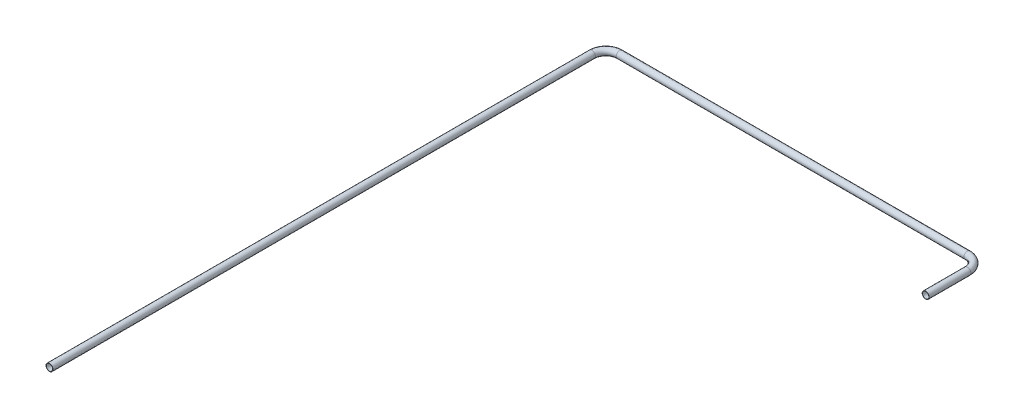
ISO-10303-21;
HEADER;
FILE_DESCRIPTION(('STEP AP214'),'2;1');
FILE_NAME('part.step','',(''),(''),'','','');
FILE_SCHEMA(('AUTOMOTIVE_DESIGN { 1 0 10303 214 1 1 1 1 }'));
ENDSEC;
DATA;
#1=APPLICATION_CONTEXT('core data for automotive mechanical design processes');
#2=APPLICATION_PROTOCOL_DEFINITION('international standard','automotive_design',2000,#1);
#3=PRODUCT_CONTEXT('',#1,'mechanical');
#4=PRODUCT('Part','Part','',(#3));
#5=PRODUCT_RELATED_PRODUCT_CATEGORY('part','',(#4));
#6=PRODUCT_DEFINITION_FORMATION('','',#4);
#7=PRODUCT_DEFINITION_CONTEXT('part definition',#1,'design');
#8=PRODUCT_DEFINITION('design','',#6,#7);
#9=PRODUCT_DEFINITION_SHAPE('','',#8);
#10=(LENGTH_UNIT() NAMED_UNIT(*) SI_UNIT(.MILLI.,.METRE.));
#11=(NAMED_UNIT(*) PLANE_ANGLE_UNIT() SI_UNIT($,.RADIAN.));
#12=(NAMED_UNIT(*) SI_UNIT($,.STERADIAN.) SOLID_ANGLE_UNIT());
#13=UNCERTAINTY_MEASURE_WITH_UNIT(LENGTH_MEASURE(1.E-05),#10,'distance_accuracy_value','');
#14=(GEOMETRIC_REPRESENTATION_CONTEXT(3) GLOBAL_UNCERTAINTY_ASSIGNED_CONTEXT((#13)) GLOBAL_UNIT_ASSIGNED_CONTEXT((#10,
#11,#12)) REPRESENTATION_CONTEXT('',''));
#15=CARTESIAN_POINT('',(0.,0.,0.));
#16=DIRECTION('',(0.,0.,1.));
#17=DIRECTION('',(1.,0.,0.));
#18=AXIS2_PLACEMENT_3D('',#15,#16,#17);
#19=CARTESIAN_POINT('',(-4114.8,0.,6096.));
#20=DIRECTION('',(0.,0.,-1.));
#21=DIRECTION('',(-1.,0.,0.));
#22=AXIS2_PLACEMENT_3D('',#19,#20,#21);
#23=CYLINDRICAL_SURFACE('',#22,38.1);
#24=CARTESIAN_POINT('',(-4114.8,0.,152.4));
#25=DIRECTION('',(0.,0.,-1.));
#26=DIRECTION('',(-1.,0.,0.));
#27=AXIS2_PLACEMENT_3D('',#24,#25,#26);
#28=CIRCLE('',#27,38.1);
#29=CARTESIAN_POINT('',(-4152.9,0.,152.4));
#30=VERTEX_POINT('',#29);
#31=EDGE_CURVE('E82',#30,#30,#28,.T.);
#32=ORIENTED_EDGE('',*,*,#31,.F.);
#33=EDGE_LOOP('',(#32));
#34=FACE_BOUND('',#33,.T.);
#35=CARTESIAN_POINT('',(-4114.8,0.,6096.));
#36=DIRECTION('',(0.,0.,-1.));
#37=DIRECTION('',(-1.,0.,0.));
#38=AXIS2_PLACEMENT_3D('',#35,#36,#37);
#39=CIRCLE('',#38,38.1);
#40=CARTESIAN_POINT('',(-4152.9,0.,6096.));
#41=VERTEX_POINT('',#40);
#42=EDGE_CURVE('E49',#41,#41,#39,.T.);
#43=ORIENTED_EDGE('',*,*,#42,.T.);
#44=EDGE_LOOP('',(#43));
#45=FACE_BOUND('',#44,.T.);
#46=ADVANCED_FACE('F34',(#34,#45),#23,.T.);
#47=CARTESIAN_POINT('',(-3962.4,0.,152.4));
#48=DIRECTION('',(0.,-1.,0.));
#49=DIRECTION('',(0.,0.,-1.));
#50=AXIS2_PLACEMENT_3D('',#47,#48,#49);
#51=TOROIDAL_SURFACE('',#50,152.4,38.1);
#52=CARTESIAN_POINT('',(-3962.4,0.,6.75705473597476E-13));
#53=DIRECTION('',(1.,0.,0.));
#54=DIRECTION('',(0.,0.,-1.));
#55=AXIS2_PLACEMENT_3D('',#52,#53,#54);
#56=CIRCLE('',#55,38.1);
#57=CARTESIAN_POINT('',(-3962.4,0.,-38.0999999999992));
#58=VERTEX_POINT('',#57);
#59=EDGE_CURVE('E85',#58,#58,#56,.T.);
#60=CARTESIAN_POINT('',(-3962.4,0.,152.4));
#61=DIRECTION('',(0.,-1.,0.));
#62=DIRECTION('',(0.,0.,-1.));
#63=AXIS2_PLACEMENT_3D('',#60,#61,#62);
#64=CIRCLE('',#63,190.5);
#65=EDGE_CURVE('',#30,#58,#64,.T.);
#66=ORIENTED_EDGE('',*,*,#31,.T.);
#67=ORIENTED_EDGE('',*,*,#59,.F.);
#68=ORIENTED_EDGE('',*,*,#65,.T.);
#69=ORIENTED_EDGE('',*,*,#65,.F.);
#70=EDGE_LOOP('',(#66,#68,#67,#69));
#71=FACE_BOUND('',#70,.T.);
#72=ADVANCED_FACE('F103',(#71),#51,.T.);
#73=CARTESIAN_POINT('',(-3962.4,0.,4.81416444288074E-13));
#74=DIRECTION('',(1.,0.,0.));
#75=DIRECTION('',(0.,0.,-1.));
#76=AXIS2_PLACEMENT_3D('',#73,#74,#75);
#77=CYLINDRICAL_SURFACE('',#76,38.1);
#78=CARTESIAN_POINT('',(-152.4,0.,0.));
#79=DIRECTION('',(1.,0.,0.));
#80=DIRECTION('',(0.,0.,-1.));
#81=AXIS2_PLACEMENT_3D('',#78,#79,#80);
#82=CIRCLE('',#81,38.1);
#83=CARTESIAN_POINT('',(-152.4,0.,-38.1));
#84=VERTEX_POINT('',#83);
#85=EDGE_CURVE('E87',#84,#84,#82,.T.);
#86=ORIENTED_EDGE('',*,*,#85,.F.);
#87=EDGE_LOOP('',(#86));
#88=FACE_BOUND('',#87,.T.);
#89=ORIENTED_EDGE('',*,*,#59,.T.);
#90=EDGE_LOOP('',(#89));
#91=FACE_BOUND('',#90,.T.);
#92=ADVANCED_FACE('F97',(#88,#91),#77,.T.);
#93=CARTESIAN_POINT('',(-152.4,0.,152.4));
#94=DIRECTION('',(0.,-1.,0.));
#95=DIRECTION('',(0.,0.,-1.));
#96=AXIS2_PLACEMENT_3D('',#93,#94,#95);
#97=TOROIDAL_SURFACE('',#96,152.4,38.1);
#98=CARTESIAN_POINT('',(0.,0.,152.4));
#99=DIRECTION('',(0.,0.,1.));
#100=DIRECTION('',(1.,0.,0.));
#101=AXIS2_PLACEMENT_3D('',#98,#99,#100);
#102=CIRCLE('',#101,38.1);
#103=CARTESIAN_POINT('',(38.0999999999999,0.,152.4));
#104=VERTEX_POINT('',#103);
#105=EDGE_CURVE('E38',#104,#104,#102,.T.);
#106=CARTESIAN_POINT('',(-152.4,0.,152.4));
#107=DIRECTION('',(0.,-1.,0.));
#108=DIRECTION('',(0.,0.,-1.));
#109=AXIS2_PLACEMENT_3D('',#106,#107,#108);
#110=CIRCLE('',#109,190.5);
#111=EDGE_CURVE('',#84,#104,#110,.T.);
#112=ORIENTED_EDGE('',*,*,#85,.T.);
#113=ORIENTED_EDGE('',*,*,#105,.F.);
#114=ORIENTED_EDGE('',*,*,#111,.T.);
#115=ORIENTED_EDGE('',*,*,#111,.F.);
#116=EDGE_LOOP('',(#112,#114,#113,#115));
#117=FACE_BOUND('',#116,.T.);
#118=ADVANCED_FACE('F95',(#117),#97,.T.);
#119=CARTESIAN_POINT('',(0.,0.,152.4));
#120=DIRECTION('',(0.,0.,1.));
#121=DIRECTION('',(1.,0.,0.));
#122=AXIS2_PLACEMENT_3D('',#119,#120,#121);
#123=CYLINDRICAL_SURFACE('',#122,38.1);
#124=CARTESIAN_POINT('',(0.,0.,609.6));
#125=DIRECTION('',(0.,0.,1.));
#126=DIRECTION('',(1.,0.,0.));
#127=AXIS2_PLACEMENT_3D('',#124,#125,#126);
#128=CIRCLE('',#127,38.1);
#129=CARTESIAN_POINT('',(38.1,0.,609.6));
#130=VERTEX_POINT('',#129);
#131=EDGE_CURVE('E54',#130,#130,#128,.T.);
#132=ORIENTED_EDGE('',*,*,#131,.F.);
#133=EDGE_LOOP('',(#132));
#134=FACE_BOUND('',#133,.T.);
#135=ORIENTED_EDGE('',*,*,#105,.T.);
#136=EDGE_LOOP('',(#135));
#137=FACE_BOUND('',#136,.T.);
#138=ADVANCED_FACE('F36',(#134,#137),#123,.T.);
#139=CARTESIAN_POINT('',(-4114.8,0.,6096.));
#140=DIRECTION('',(0.,0.,-1.));
#141=DIRECTION('',(-1.,0.,0.));
#142=AXIS2_PLACEMENT_3D('',#139,#140,#141);
#143=PLANE('',#142);
#144=CARTESIAN_POINT('',(-4114.8,0.,6096.));
#145=DIRECTION('',(0.,0.,-1.));
#146=DIRECTION('',(-1.,0.,0.));
#147=AXIS2_PLACEMENT_3D('',#144,#145,#146);
#148=CIRCLE('',#147,34.925);
#149=CARTESIAN_POINT('',(-4149.725,0.,6096.));
#150=VERTEX_POINT('',#149);
#151=EDGE_CURVE('E80',#150,#150,#148,.F.);
#152=ORIENTED_EDGE('',*,*,#151,.F.);
#153=EDGE_LOOP('',(#152));
#154=FACE_BOUND('',#153,.T.);
#155=ORIENTED_EDGE('',*,*,#42,.F.);
#156=EDGE_LOOP('',(#155));
#157=FACE_BOUND('',#156,.T.);
#158=ADVANCED_FACE('F102',(#154,#157),#143,.F.);
#159=CARTESIAN_POINT('',(0.,0.,609.6));
#160=DIRECTION('',(0.,0.,1.));
#161=DIRECTION('',(1.,0.,0.));
#162=AXIS2_PLACEMENT_3D('',#159,#160,#161);
#163=PLANE('',#162);
#164=CARTESIAN_POINT('',(0.,0.,609.6));
#165=DIRECTION('',(0.,0.,1.));
#166=DIRECTION('',(1.,0.,0.));
#167=AXIS2_PLACEMENT_3D('',#164,#165,#166);
#168=CIRCLE('',#167,34.925);
#169=CARTESIAN_POINT('',(34.925,0.,609.6));
#170=VERTEX_POINT('',#169);
#171=EDGE_CURVE('E11',#170,#170,#168,.F.);
#172=ORIENTED_EDGE('',*,*,#171,.T.);
#173=EDGE_LOOP('',(#172));
#174=FACE_BOUND('',#173,.T.);
#175=ORIENTED_EDGE('',*,*,#131,.T.);
#176=EDGE_LOOP('',(#175));
#177=FACE_BOUND('',#176,.T.);
#178=ADVANCED_FACE('F61',(#174,#177),#163,.T.);
#179=CARTESIAN_POINT('',(-4114.8,0.,6096.));
#180=DIRECTION('',(0.,0.,-1.));
#181=DIRECTION('',(-1.,0.,0.));
#182=AXIS2_PLACEMENT_3D('',#179,#180,#181);
#183=CYLINDRICAL_SURFACE('',#182,34.925);
#184=CARTESIAN_POINT('',(-4114.8,0.,152.4));
#185=DIRECTION('',(0.,0.,-1.));
#186=DIRECTION('',(-1.,0.,0.));
#187=AXIS2_PLACEMENT_3D('',#184,#185,#186);
#188=CIRCLE('',#187,34.925);
#189=CARTESIAN_POINT('',(-4149.725,0.,152.4));
#190=VERTEX_POINT('',#189);
#191=EDGE_CURVE('E136',#190,#190,#188,.F.);
#192=ORIENTED_EDGE('',*,*,#191,.F.);
#193=EDGE_LOOP('',(#192));
#194=FACE_BOUND('',#193,.T.);
#195=ORIENTED_EDGE('',*,*,#151,.T.);
#196=EDGE_LOOP('',(#195));
#197=FACE_BOUND('',#196,.T.);
#198=ADVANCED_FACE('F117',(#194,#197),#183,.F.);
#199=CARTESIAN_POINT('',(-3962.4,0.,152.4));
#200=DIRECTION('',(0.,-1.,0.));
#201=DIRECTION('',(0.,0.,-1.));
#202=AXIS2_PLACEMENT_3D('',#199,#200,#201);
#203=TOROIDAL_SURFACE('',#202,152.4,34.925);
#204=CARTESIAN_POINT('',(-3962.4,0.,6.75705473597476E-13));
#205=DIRECTION('',(1.,0.,0.));
#206=DIRECTION('',(0.,0.,-1.));
#207=AXIS2_PLACEMENT_3D('',#204,#205,#206);
#208=CIRCLE('',#207,34.925);
#209=CARTESIAN_POINT('',(-3962.4,0.,-34.9249999999992));
#210=VERTEX_POINT('',#209);
#211=EDGE_CURVE('E75',#210,#210,#208,.F.);
#212=CARTESIAN_POINT('',(-3962.4,0.,152.4));
#213=DIRECTION('',(0.,-1.,0.));
#214=DIRECTION('',(0.,0.,-1.));
#215=AXIS2_PLACEMENT_3D('',#212,#213,#214);
#216=CIRCLE('',#215,187.325);
#217=EDGE_CURVE('',#190,#210,#216,.T.);
#218=ORIENTED_EDGE('',*,*,#191,.T.);
#219=ORIENTED_EDGE('',*,*,#211,.F.);
#220=ORIENTED_EDGE('',*,*,#217,.T.);
#221=ORIENTED_EDGE('',*,*,#217,.F.);
#222=EDGE_LOOP('',(#218,#220,#219,#221));
#223=FACE_BOUND('',#222,.T.);
#224=ADVANCED_FACE('F124',(#223),#203,.F.);
#225=CARTESIAN_POINT('',(-3962.4,0.,4.81416444288074E-13));
#226=DIRECTION('',(1.,0.,0.));
#227=DIRECTION('',(0.,0.,-1.));
#228=AXIS2_PLACEMENT_3D('',#225,#226,#227);
#229=CYLINDRICAL_SURFACE('',#228,34.925);
#230=CARTESIAN_POINT('',(-152.4,0.,0.));
#231=DIRECTION('',(1.,0.,0.));
#232=DIRECTION('',(0.,0.,-1.));
#233=AXIS2_PLACEMENT_3D('',#230,#231,#232);
#234=CIRCLE('',#233,34.925);
#235=CARTESIAN_POINT('',(-152.4,0.,-34.925));
#236=VERTEX_POINT('',#235);
#237=EDGE_CURVE('E72',#236,#236,#234,.F.);
#238=ORIENTED_EDGE('',*,*,#237,.F.);
#239=EDGE_LOOP('',(#238));
#240=FACE_BOUND('',#239,.T.);
#241=ORIENTED_EDGE('',*,*,#211,.T.);
#242=EDGE_LOOP('',(#241));
#243=FACE_BOUND('',#242,.T.);
#244=ADVANCED_FACE('F121',(#240,#243),#229,.F.);
#245=CARTESIAN_POINT('',(-152.4,0.,152.4));
#246=DIRECTION('',(0.,-1.,0.));
#247=DIRECTION('',(0.,0.,-1.));
#248=AXIS2_PLACEMENT_3D('',#245,#246,#247);
#249=TOROIDAL_SURFACE('',#248,152.4,34.925);
#250=CARTESIAN_POINT('',(0.,0.,152.4));
#251=DIRECTION('',(0.,0.,1.));
#252=DIRECTION('',(1.,0.,0.));
#253=AXIS2_PLACEMENT_3D('',#250,#251,#252);
#254=CIRCLE('',#253,34.925);
#255=CARTESIAN_POINT('',(34.925,0.,152.4));
#256=VERTEX_POINT('',#255);
#257=EDGE_CURVE('E43',#256,#256,#254,.F.);
#258=CARTESIAN_POINT('',(-152.4,0.,152.4));
#259=DIRECTION('',(0.,-1.,0.));
#260=DIRECTION('',(0.,0.,-1.));
#261=AXIS2_PLACEMENT_3D('',#258,#259,#260);
#262=CIRCLE('',#261,187.325);
#263=EDGE_CURVE('',#236,#256,#262,.T.);
#264=ORIENTED_EDGE('',*,*,#237,.T.);
#265=ORIENTED_EDGE('',*,*,#257,.F.);
#266=ORIENTED_EDGE('',*,*,#263,.T.);
#267=ORIENTED_EDGE('',*,*,#263,.F.);
#268=EDGE_LOOP('',(#264,#266,#265,#267));
#269=FACE_BOUND('',#268,.T.);
#270=ADVANCED_FACE('F67',(#269),#249,.F.);
#271=CARTESIAN_POINT('',(0.,0.,152.4));
#272=DIRECTION('',(0.,0.,1.));
#273=DIRECTION('',(1.,0.,0.));
#274=AXIS2_PLACEMENT_3D('',#271,#272,#273);
#275=CYLINDRICAL_SURFACE('',#274,34.925);
#276=ORIENTED_EDGE('',*,*,#171,.F.);
#277=EDGE_LOOP('',(#276));
#278=FACE_BOUND('',#277,.T.);
#279=ORIENTED_EDGE('',*,*,#257,.T.);
#280=EDGE_LOOP('',(#279));
#281=FACE_BOUND('',#280,.T.);
#282=ADVANCED_FACE('F64',(#278,#281),#275,.F.);
#283=CLOSED_SHELL('',(#46,#72,#92,#118,#138,#158,#178,#198,#224,#244,#270,#282));
#284=MANIFOLD_SOLID_BREP('B2',#283);
#285=ADVANCED_BREP_SHAPE_REPRESENTATION('',(#18,#284),#14);
#286=SHAPE_DEFINITION_REPRESENTATION(#9,#285);
ENDSEC;
END-ISO-10303-21;
